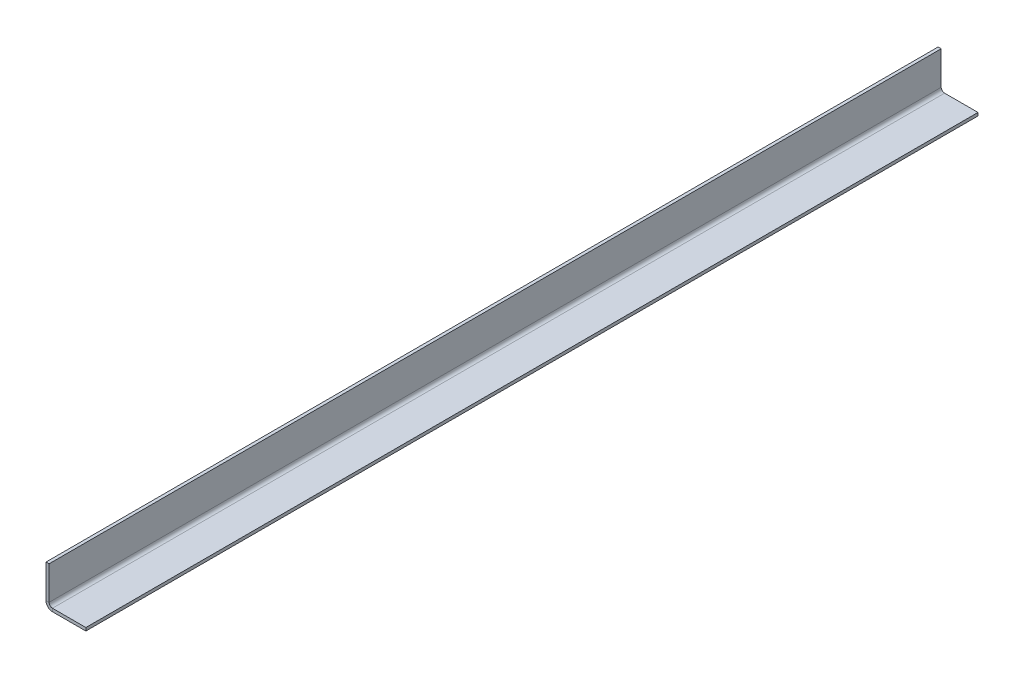
ISO-10303-21;
HEADER;
FILE_DESCRIPTION(('STEP AP214'),'2;1');
FILE_NAME('part.step','',(''),(''),'','','');
FILE_SCHEMA(('AUTOMOTIVE_DESIGN { 1 0 10303 214 1 1 1 1 }'));
ENDSEC;
DATA;
#1=APPLICATION_CONTEXT('core data for automotive mechanical design processes');
#2=APPLICATION_PROTOCOL_DEFINITION('international standard','automotive_design',2000,#1);
#3=PRODUCT_CONTEXT('',#1,'mechanical');
#4=PRODUCT('Part','Part','',(#3));
#5=PRODUCT_RELATED_PRODUCT_CATEGORY('part','',(#4));
#6=PRODUCT_DEFINITION_FORMATION('','',#4);
#7=PRODUCT_DEFINITION_CONTEXT('part definition',#1,'design');
#8=PRODUCT_DEFINITION('design','',#6,#7);
#9=PRODUCT_DEFINITION_SHAPE('','',#8);
#10=(LENGTH_UNIT() NAMED_UNIT(*) SI_UNIT(.MILLI.,.METRE.));
#11=(NAMED_UNIT(*) PLANE_ANGLE_UNIT() SI_UNIT($,.RADIAN.));
#12=(NAMED_UNIT(*) SI_UNIT($,.STERADIAN.) SOLID_ANGLE_UNIT());
#13=UNCERTAINTY_MEASURE_WITH_UNIT(LENGTH_MEASURE(1.E-05),#10,'distance_accuracy_value','');
#14=(GEOMETRIC_REPRESENTATION_CONTEXT(3) GLOBAL_UNCERTAINTY_ASSIGNED_CONTEXT((#13)) GLOBAL_UNIT_ASSIGNED_CONTEXT((#10,
#11,#12)) REPRESENTATION_CONTEXT('',''));
#15=CARTESIAN_POINT('',(0.,0.,0.));
#16=DIRECTION('',(0.,0.,1.));
#17=DIRECTION('',(1.,0.,0.));
#18=AXIS2_PLACEMENT_3D('',#15,#16,#17);
#19=CARTESIAN_POINT('',(-25.7928740128807,0.,291.));
#20=DIRECTION('',(0.,0.,1.));
#21=DIRECTION('',(1.,0.,0.));
#22=AXIS2_PLACEMENT_3D('',#19,#20,#21);
#23=PLANE('',#22);
#24=DIRECTION('',(0.,-1.,0.));
#25=VECTOR('',#24,1.);
#26=CARTESIAN_POINT('',(-25.7928740128807,0.,291.));
#27=LINE('',#26,#25);
#28=CARTESIAN_POINT('',(-25.7928740128807,0.,291.));
#29=VERTEX_POINT('',#28);
#30=CARTESIAN_POINT('',(-25.7928740128807,-1.,291.));
#31=VERTEX_POINT('',#30);
#32=EDGE_CURVE('E11',#29,#31,#27,.T.);
#33=ORIENTED_EDGE('',*,*,#32,.F.);
#34=CARTESIAN_POINT('',(-25.7928740128807,1.1,291.));
#35=DIRECTION('',(0.,0.,-1.));
#36=DIRECTION('',(-1.,0.,0.));
#37=AXIS2_PLACEMENT_3D('',#34,#35,#36);
#38=CIRCLE('',#37,1.1);
#39=CARTESIAN_POINT('',(-26.8928740128807,1.1,291.));
#40=VERTEX_POINT('',#39);
#41=EDGE_CURVE('E132',#40,#29,#38,.F.);
#42=ORIENTED_EDGE('',*,*,#41,.F.);
#43=DIRECTION('',(1.,0.,0.));
#44=VECTOR('',#43,1.);
#45=CARTESIAN_POINT('',(-27.8928740128807,1.1,291.));
#46=LINE('',#45,#44);
#47=CARTESIAN_POINT('',(-27.8928740128807,1.1,291.));
#48=VERTEX_POINT('',#47);
#49=EDGE_CURVE('E43',#48,#40,#46,.T.);
#50=ORIENTED_EDGE('',*,*,#49,.F.);
#51=CARTESIAN_POINT('',(-25.7928740128807,1.1,291.));
#52=DIRECTION('',(0.,0.,1.));
#53=DIRECTION('',(1.,0.,0.));
#54=AXIS2_PLACEMENT_3D('',#51,#52,#53);
#55=CIRCLE('',#54,2.1);
#56=EDGE_CURVE('E125',#48,#31,#55,.T.);
#57=ORIENTED_EDGE('',*,*,#56,.T.);
#58=EDGE_LOOP('',(#33,#42,#50,#57));
#59=FACE_BOUND('',#58,.T.);
#60=ADVANCED_FACE('F35',(#59),#23,.T.);
#61=CARTESIAN_POINT('',(-27.8928740128807,1.1,291.));
#62=DIRECTION('',(0.,0.,1.));
#63=DIRECTION('',(1.,0.,0.));
#64=AXIS2_PLACEMENT_3D('',#61,#62,#63);
#65=PLANE('',#64);
#66=DIRECTION('',(1.,0.,0.));
#67=VECTOR('',#66,1.);
#68=CARTESIAN_POINT('',(-26.8928740128807,0.,291.));
#69=LINE('',#68,#67);
#70=CARTESIAN_POINT('',(-14.8928740128807,0.,291.));
#71=VERTEX_POINT('',#70);
#72=EDGE_CURVE('E181',#29,#71,#69,.T.);
#73=ORIENTED_EDGE('',*,*,#72,.F.);
#74=ORIENTED_EDGE('',*,*,#32,.T.);
#75=DIRECTION('',(1.,0.,0.));
#76=VECTOR('',#75,1.);
#77=CARTESIAN_POINT('',(-26.8928740128807,-1.,291.));
#78=LINE('',#77,#76);
#79=CARTESIAN_POINT('',(-14.8928740128807,-1.,291.));
#80=VERTEX_POINT('',#79);
#81=EDGE_CURVE('E91',#31,#80,#78,.T.);
#82=ORIENTED_EDGE('',*,*,#81,.T.);
#83=DIRECTION('',(0.,-1.,0.));
#84=VECTOR('',#83,1.);
#85=CARTESIAN_POINT('',(-14.8928740128807,0.,291.));
#86=LINE('',#85,#84);
#87=EDGE_CURVE('E338',#71,#80,#86,.T.);
#88=ORIENTED_EDGE('',*,*,#87,.F.);
#89=EDGE_LOOP('',(#73,#74,#82,#88));
#90=FACE_BOUND('',#89,.T.);
#91=ADVANCED_FACE('F189',(#90),#65,.T.);
#92=CARTESIAN_POINT('',(-26.8928740128807,1.1,0.));
#93=DIRECTION('',(0.,0.,-1.));
#94=DIRECTION('',(-1.,0.,0.));
#95=AXIS2_PLACEMENT_3D('',#92,#93,#94);
#96=PLANE('',#95);
#97=DIRECTION('',(-1.,0.,0.));
#98=VECTOR('',#97,1.);
#99=CARTESIAN_POINT('',(-26.8928740128807,1.1,0.));
#100=LINE('',#99,#98);
#101=CARTESIAN_POINT('',(-26.8928740128807,1.1,0.));
#102=VERTEX_POINT('',#101);
#103=CARTESIAN_POINT('',(-27.8928740128807,1.1,0.));
#104=VERTEX_POINT('',#103);
#105=EDGE_CURVE('E78',#102,#104,#100,.T.);
#106=ORIENTED_EDGE('',*,*,#105,.F.);
#107=CARTESIAN_POINT('',(-25.7928740128807,1.1,0.));
#108=DIRECTION('',(0.,0.,-1.));
#109=DIRECTION('',(-1.,0.,0.));
#110=AXIS2_PLACEMENT_3D('',#107,#108,#109);
#111=CIRCLE('',#110,1.1);
#112=CARTESIAN_POINT('',(-25.7928740128807,0.,0.));
#113=VERTEX_POINT('',#112);
#114=EDGE_CURVE('E147',#102,#113,#111,.F.);
#115=ORIENTED_EDGE('',*,*,#114,.T.);
#116=DIRECTION('',(0.,1.,0.));
#117=VECTOR('',#116,1.);
#118=CARTESIAN_POINT('',(-25.7928740128807,-1.,0.));
#119=LINE('',#118,#117);
#120=CARTESIAN_POINT('',(-25.7928740128807,-1.,0.));
#121=VERTEX_POINT('',#120);
#122=EDGE_CURVE('E85',#121,#113,#119,.T.);
#123=ORIENTED_EDGE('',*,*,#122,.F.);
#124=CARTESIAN_POINT('',(-25.7928740128807,1.1,0.));
#125=DIRECTION('',(0.,0.,1.));
#126=DIRECTION('',(1.,0.,0.));
#127=AXIS2_PLACEMENT_3D('',#124,#125,#126);
#128=CIRCLE('',#127,2.1);
#129=EDGE_CURVE('E154',#104,#121,#128,.T.);
#130=ORIENTED_EDGE('',*,*,#129,.F.);
#131=EDGE_LOOP('',(#106,#115,#123,#130));
#132=FACE_BOUND('',#131,.T.);
#133=ADVANCED_FACE('F187',(#132),#96,.T.);
#134=CARTESIAN_POINT('',(-25.7928740128807,-1.,0.));
#135=DIRECTION('',(0.,0.,-1.));
#136=DIRECTION('',(-1.,0.,0.));
#137=AXIS2_PLACEMENT_3D('',#134,#135,#136);
#138=PLANE('',#137);
#139=DIRECTION('',(0.,-1.,0.));
#140=VECTOR('',#139,1.);
#141=CARTESIAN_POINT('',(-26.8928740128807,12.,0.));
#142=LINE('',#141,#140);
#143=CARTESIAN_POINT('',(-26.8928740128807,12.,0.));
#144=VERTEX_POINT('',#143);
#145=EDGE_CURVE('E149',#144,#102,#142,.T.);
#146=ORIENTED_EDGE('',*,*,#145,.T.);
#147=ORIENTED_EDGE('',*,*,#105,.T.);
#148=DIRECTION('',(0.,-1.,0.));
#149=VECTOR('',#148,1.);
#150=CARTESIAN_POINT('',(-27.8928740128807,12.,0.));
#151=LINE('',#150,#149);
#152=CARTESIAN_POINT('',(-27.8928740128807,12.,0.));
#153=VERTEX_POINT('',#152);
#154=EDGE_CURVE('E152',#153,#104,#151,.T.);
#155=ORIENTED_EDGE('',*,*,#154,.F.);
#156=DIRECTION('',(1.,0.,0.));
#157=VECTOR('',#156,1.);
#158=CARTESIAN_POINT('',(-27.8928740128807,12.,0.));
#159=LINE('',#158,#157);
#160=EDGE_CURVE('E113',#153,#144,#159,.T.);
#161=ORIENTED_EDGE('',*,*,#160,.T.);
#162=EDGE_LOOP('',(#146,#147,#155,#161));
#163=FACE_BOUND('',#162,.T.);
#164=ADVANCED_FACE('F183',(#163),#138,.T.);
#165=CARTESIAN_POINT('',(-26.8928740128807,-1.,291.));
#166=DIRECTION('',(0.,1.,0.));
#167=DIRECTION('',(0.,0.,1.));
#168=AXIS2_PLACEMENT_3D('',#165,#166,#167);
#169=PLANE('',#168);
#170=DIRECTION('',(1.,0.,0.));
#171=VECTOR('',#170,1.);
#172=CARTESIAN_POINT('',(-26.8928740128807,-1.,0.));
#173=LINE('',#172,#171);
#174=CARTESIAN_POINT('',(-14.8928740128807,-1.,0.));
#175=VERTEX_POINT('',#174);
#176=EDGE_CURVE('E138',#121,#175,#173,.T.);
#177=ORIENTED_EDGE('',*,*,#176,.T.);
#178=DIRECTION('',(0.,0.,-1.));
#179=VECTOR('',#178,1.);
#180=CARTESIAN_POINT('',(-14.8928740128807,-1.,291.));
#181=LINE('',#180,#179);
#182=EDGE_CURVE('E168',#80,#175,#181,.T.);
#183=ORIENTED_EDGE('',*,*,#182,.F.);
#184=ORIENTED_EDGE('',*,*,#81,.F.);
#185=DIRECTION('',(0.,0.,-1.));
#186=VECTOR('',#185,1.);
#187=CARTESIAN_POINT('',(-25.7928740128807,-1.,291.));
#188=LINE('',#187,#186);
#189=EDGE_CURVE('E137',#31,#121,#188,.T.);
#190=ORIENTED_EDGE('',*,*,#189,.T.);
#191=EDGE_LOOP('',(#177,#183,#184,#190));
#192=FACE_BOUND('',#191,.T.);
#193=ADVANCED_FACE('F195',(#192),#169,.F.);
#194=CARTESIAN_POINT('',(-14.8928740128807,0.,291.));
#195=DIRECTION('',(1.,0.,0.));
#196=DIRECTION('',(0.,0.,-1.));
#197=AXIS2_PLACEMENT_3D('',#194,#195,#196);
#198=PLANE('',#197);
#199=DIRECTION('',(0.,-1.,0.));
#200=VECTOR('',#199,1.);
#201=CARTESIAN_POINT('',(-14.8928740128807,0.,0.));
#202=LINE('',#201,#200);
#203=CARTESIAN_POINT('',(-14.8928740128807,0.,0.));
#204=VERTEX_POINT('',#203);
#205=EDGE_CURVE('E141',#204,#175,#202,.T.);
#206=ORIENTED_EDGE('',*,*,#205,.F.);
#207=DIRECTION('',(0.,0.,-1.));
#208=VECTOR('',#207,1.);
#209=CARTESIAN_POINT('',(-14.8928740128807,0.,291.));
#210=LINE('',#209,#208);
#211=EDGE_CURVE('E166',#71,#204,#210,.T.);
#212=ORIENTED_EDGE('',*,*,#211,.F.);
#213=ORIENTED_EDGE('',*,*,#87,.T.);
#214=ORIENTED_EDGE('',*,*,#182,.T.);
#215=EDGE_LOOP('',(#206,#212,#213,#214));
#216=FACE_BOUND('',#215,.T.);
#217=ADVANCED_FACE('F226',(#216),#198,.T.);
#218=CARTESIAN_POINT('',(-26.8928740128807,0.,291.));
#219=DIRECTION('',(0.,1.,0.));
#220=DIRECTION('',(0.,0.,1.));
#221=AXIS2_PLACEMENT_3D('',#218,#219,#220);
#222=PLANE('',#221);
#223=DIRECTION('',(1.,0.,0.));
#224=VECTOR('',#223,1.);
#225=CARTESIAN_POINT('',(-26.8928740128807,0.,0.));
#226=LINE('',#225,#224);
#227=EDGE_CURVE('E144',#113,#204,#226,.T.);
#228=ORIENTED_EDGE('',*,*,#227,.F.);
#229=DIRECTION('',(0.,0.,-1.));
#230=VECTOR('',#229,1.);
#231=CARTESIAN_POINT('',(-25.7928740128807,0.,291.));
#232=LINE('',#231,#230);
#233=EDGE_CURVE('E163',#29,#113,#232,.T.);
#234=ORIENTED_EDGE('',*,*,#233,.F.);
#235=ORIENTED_EDGE('',*,*,#72,.T.);
#236=ORIENTED_EDGE('',*,*,#211,.T.);
#237=EDGE_LOOP('',(#228,#234,#235,#236));
#238=FACE_BOUND('',#237,.T.);
#239=ADVANCED_FACE('F237',(#238),#222,.T.);
#240=CARTESIAN_POINT('',(-25.7928740128807,1.1,291.));
#241=DIRECTION('',(0.,0.,-1.));
#242=DIRECTION('',(-1.,0.,0.));
#243=AXIS2_PLACEMENT_3D('',#240,#241,#242);
#244=CYLINDRICAL_SURFACE('',#243,1.1);
#245=ORIENTED_EDGE('',*,*,#114,.F.);
#246=DIRECTION('',(0.,0.,-1.));
#247=VECTOR('',#246,1.);
#248=CARTESIAN_POINT('',(-26.8928740128807,1.1,291.));
#249=LINE('',#248,#247);
#250=EDGE_CURVE('E160',#40,#102,#249,.T.);
#251=ORIENTED_EDGE('',*,*,#250,.F.);
#252=ORIENTED_EDGE('',*,*,#41,.T.);
#253=ORIENTED_EDGE('',*,*,#233,.T.);
#254=EDGE_LOOP('',(#245,#251,#252,#253));
#255=FACE_BOUND('',#254,.T.);
#256=ADVANCED_FACE('F177',(#255),#244,.F.);
#257=CARTESIAN_POINT('',(-26.8928740128807,12.,291.));
#258=DIRECTION('',(1.,0.,0.));
#259=DIRECTION('',(0.,1.,0.));
#260=AXIS2_PLACEMENT_3D('',#257,#258,#259);
#261=PLANE('',#260);
#262=ORIENTED_EDGE('',*,*,#145,.F.);
#263=DIRECTION('',(0.,0.,-1.));
#264=VECTOR('',#263,1.);
#265=CARTESIAN_POINT('',(-26.8928740128807,12.,291.));
#266=LINE('',#265,#264);
#267=CARTESIAN_POINT('',(-26.8928740128807,12.,291.));
#268=VERTEX_POINT('',#267);
#269=EDGE_CURVE('E115',#268,#144,#266,.T.);
#270=ORIENTED_EDGE('',*,*,#269,.F.);
#271=DIRECTION('',(0.,-1.,0.));
#272=VECTOR('',#271,1.);
#273=CARTESIAN_POINT('',(-26.8928740128807,12.,291.));
#274=LINE('',#273,#272);
#275=EDGE_CURVE('E130',#268,#40,#274,.T.);
#276=ORIENTED_EDGE('',*,*,#275,.T.);
#277=ORIENTED_EDGE('',*,*,#250,.T.);
#278=EDGE_LOOP('',(#262,#270,#276,#277));
#279=FACE_BOUND('',#278,.T.);
#280=ADVANCED_FACE('F182',(#279),#261,.T.);
#281=CARTESIAN_POINT('',(-27.8928740128807,12.,291.));
#282=DIRECTION('',(0.,1.,0.));
#283=DIRECTION('',(0.,0.,1.));
#284=AXIS2_PLACEMENT_3D('',#281,#282,#283);
#285=PLANE('',#284);
#286=ORIENTED_EDGE('',*,*,#160,.F.);
#287=DIRECTION('',(0.,0.,-1.));
#288=VECTOR('',#287,1.);
#289=CARTESIAN_POINT('',(-27.8928740128807,12.,291.));
#290=LINE('',#289,#288);
#291=CARTESIAN_POINT('',(-27.8928740128807,12.,291.));
#292=VERTEX_POINT('',#291);
#293=EDGE_CURVE('E107',#292,#153,#290,.T.);
#294=ORIENTED_EDGE('',*,*,#293,.F.);
#295=DIRECTION('',(1.,0.,0.));
#296=VECTOR('',#295,1.);
#297=CARTESIAN_POINT('',(-27.8928740128807,12.,291.));
#298=LINE('',#297,#296);
#299=EDGE_CURVE('E111',#292,#268,#298,.T.);
#300=ORIENTED_EDGE('',*,*,#299,.T.);
#301=ORIENTED_EDGE('',*,*,#269,.T.);
#302=EDGE_LOOP('',(#286,#294,#300,#301));
#303=FACE_BOUND('',#302,.T.);
#304=ADVANCED_FACE('F109',(#303),#285,.T.);
#305=CARTESIAN_POINT('',(-27.8928740128807,12.,291.));
#306=DIRECTION('',(1.,0.,0.));
#307=DIRECTION('',(0.,1.,0.));
#308=AXIS2_PLACEMENT_3D('',#305,#306,#307);
#309=PLANE('',#308);
#310=ORIENTED_EDGE('',*,*,#154,.T.);
#311=DIRECTION('',(0.,0.,-1.));
#312=VECTOR('',#311,1.);
#313=CARTESIAN_POINT('',(-27.8928740128807,1.1,291.));
#314=LINE('',#313,#312);
#315=EDGE_CURVE('E116',#48,#104,#314,.T.);
#316=ORIENTED_EDGE('',*,*,#315,.F.);
#317=DIRECTION('',(0.,-1.,0.));
#318=VECTOR('',#317,1.);
#319=CARTESIAN_POINT('',(-27.8928740128807,12.,291.));
#320=LINE('',#319,#318);
#321=EDGE_CURVE('E120',#292,#48,#320,.T.);
#322=ORIENTED_EDGE('',*,*,#321,.F.);
#323=ORIENTED_EDGE('',*,*,#293,.T.);
#324=EDGE_LOOP('',(#310,#316,#322,#323));
#325=FACE_BOUND('',#324,.T.);
#326=ADVANCED_FACE('F121',(#325),#309,.F.);
#327=CARTESIAN_POINT('',(-25.7928740128807,1.1,291.));
#328=DIRECTION('',(0.,0.,-1.));
#329=DIRECTION('',(-1.,0.,0.));
#330=AXIS2_PLACEMENT_3D('',#327,#328,#329);
#331=CYLINDRICAL_SURFACE('',#330,2.1);
#332=ORIENTED_EDGE('',*,*,#129,.T.);
#333=ORIENTED_EDGE('',*,*,#189,.F.);
#334=ORIENTED_EDGE('',*,*,#56,.F.);
#335=ORIENTED_EDGE('',*,*,#315,.T.);
#336=EDGE_LOOP('',(#332,#333,#334,#335));
#337=FACE_BOUND('',#336,.T.);
#338=ADVANCED_FACE('F185',(#337),#331,.T.);
#339=CARTESIAN_POINT('',(-25.7928740128807,1.1,291.));
#340=DIRECTION('',(0.,0.,-1.));
#341=DIRECTION('',(-1.,0.,0.));
#342=AXIS2_PLACEMENT_3D('',#339,#340,#341);
#343=PLANE('',#342);
#344=ORIENTED_EDGE('',*,*,#321,.T.);
#345=ORIENTED_EDGE('',*,*,#49,.T.);
#346=ORIENTED_EDGE('',*,*,#275,.F.);
#347=ORIENTED_EDGE('',*,*,#299,.F.);
#348=EDGE_LOOP('',(#344,#345,#346,#347));
#349=FACE_BOUND('',#348,.T.);
#350=ADVANCED_FACE('F128',(#349),#343,.F.);
#351=CARTESIAN_POINT('',(-25.7928740128807,1.1,0.));
#352=DIRECTION('',(0.,0.,-1.));
#353=DIRECTION('',(-1.,0.,0.));
#354=AXIS2_PLACEMENT_3D('',#351,#352,#353);
#355=PLANE('',#354);
#356=ORIENTED_EDGE('',*,*,#176,.F.);
#357=ORIENTED_EDGE('',*,*,#122,.T.);
#358=ORIENTED_EDGE('',*,*,#227,.T.);
#359=ORIENTED_EDGE('',*,*,#205,.T.);
#360=EDGE_LOOP('',(#356,#357,#358,#359));
#361=FACE_BOUND('',#360,.T.);
#362=ADVANCED_FACE('F303',(#361),#355,.T.);
#363=CLOSED_SHELL('',(#60,#91,#133,#164,#193,#217,#239,#256,#280,#304,#326,#338,#350,#362));
#364=MANIFOLD_SOLID_BREP('B2',#363);
#365=ADVANCED_BREP_SHAPE_REPRESENTATION('',(#18,#364),#14);
#366=SHAPE_DEFINITION_REPRESENTATION(#9,#365);
ENDSEC;
END-ISO-10303-21;
